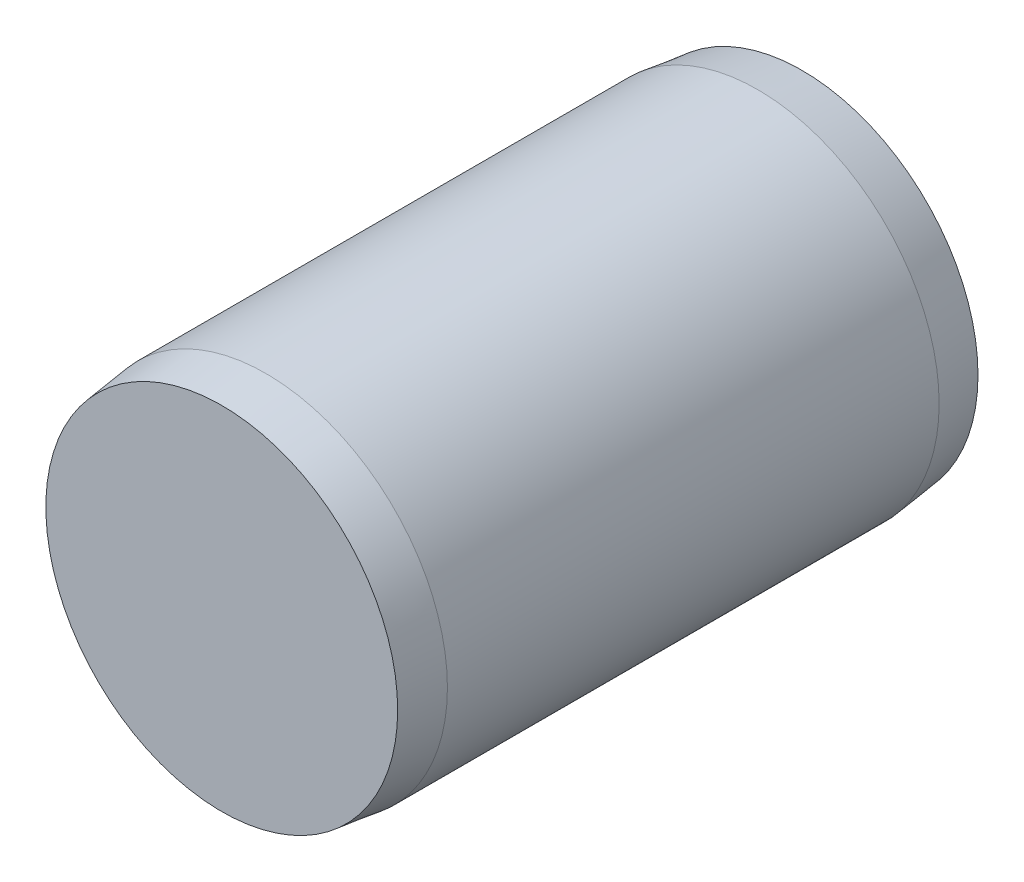
ISO-10303-21;
HEADER;
FILE_DESCRIPTION(('STEP AP214'),'2;1');
FILE_NAME('part.step','',(''),(''),'','','');
FILE_SCHEMA(('AUTOMOTIVE_DESIGN { 1 0 10303 214 1 1 1 1 }'));
ENDSEC;
DATA;
#1=APPLICATION_CONTEXT('core data for automotive mechanical design processes');
#2=APPLICATION_PROTOCOL_DEFINITION('international standard','automotive_design',2000,#1);
#3=PRODUCT_CONTEXT('',#1,'mechanical');
#4=PRODUCT('Part','Part','',(#3));
#5=PRODUCT_RELATED_PRODUCT_CATEGORY('part','',(#4));
#6=PRODUCT_DEFINITION_FORMATION('','',#4);
#7=PRODUCT_DEFINITION_CONTEXT('part definition',#1,'design');
#8=PRODUCT_DEFINITION('design','',#6,#7);
#9=PRODUCT_DEFINITION_SHAPE('','',#8);
#10=(LENGTH_UNIT() NAMED_UNIT(*) SI_UNIT(.MILLI.,.METRE.));
#11=(NAMED_UNIT(*) PLANE_ANGLE_UNIT() SI_UNIT($,.RADIAN.));
#12=(NAMED_UNIT(*) SI_UNIT($,.STERADIAN.) SOLID_ANGLE_UNIT());
#13=UNCERTAINTY_MEASURE_WITH_UNIT(LENGTH_MEASURE(1.E-05),#10,'distance_accuracy_value','');
#14=(GEOMETRIC_REPRESENTATION_CONTEXT(3) GLOBAL_UNCERTAINTY_ASSIGNED_CONTEXT((#13)) GLOBAL_UNIT_ASSIGNED_CONTEXT((#10,
#11,#12)) REPRESENTATION_CONTEXT('',''));
#15=CARTESIAN_POINT('',(0.,0.,0.));
#16=DIRECTION('',(0.,0.,1.));
#17=DIRECTION('',(1.,0.,0.));
#18=AXIS2_PLACEMENT_3D('',#15,#16,#17);
#19=CARTESIAN_POINT('',(0.,0.,-7.3891740179019));
#20=DIRECTION('',(0.,0.,1.));
#21=DIRECTION('',(1.,0.,0.));
#22=AXIS2_PLACEMENT_3D('',#19,#20,#21);
#23=CONICAL_SURFACE('',#22,2.5,0.122173047639603);
#24=CARTESIAN_POINT('',(0.,0.,-8.));
#25=DIRECTION('',(0.,0.,1.));
#26=DIRECTION('',(1.,0.,0.));
#27=AXIS2_PLACEMENT_3D('',#24,#25,#26);
#28=CIRCLE('',#27,2.425);
#29=CARTESIAN_POINT('',(2.425,0.,-8.));
#30=VERTEX_POINT('',#29);
#31=EDGE_CURVE('E10',#30,#30,#28,.T.);
#32=ORIENTED_EDGE('',*,*,#31,.T.);
#33=EDGE_LOOP('',(#32));
#34=FACE_BOUND('',#33,.T.);
#35=CARTESIAN_POINT('',(0.,0.,-7.3891740179019));
#36=DIRECTION('',(0.,0.,1.));
#37=DIRECTION('',(1.,0.,0.));
#38=AXIS2_PLACEMENT_3D('',#35,#36,#37);
#39=CIRCLE('',#38,2.5);
#40=CARTESIAN_POINT('',(2.5,0.,-7.3891740179019));
#41=VERTEX_POINT('',#40);
#42=EDGE_CURVE('E47',#41,#41,#39,.T.);
#43=ORIENTED_EDGE('',*,*,#42,.F.);
#44=EDGE_LOOP('',(#43));
#45=FACE_BOUND('',#44,.T.);
#46=ADVANCED_FACE('F33',(#34,#45),#23,.T.);
#47=CARTESIAN_POINT('',(2.425,0.,-8.));
#48=DIRECTION('',(0.,0.,-1.));
#49=DIRECTION('',(-1.,0.,0.));
#50=AXIS2_PLACEMENT_3D('',#47,#48,#49);
#51=PLANE('',#50);
#52=ORIENTED_EDGE('',*,*,#31,.F.);
#53=EDGE_LOOP('',(#52));
#54=FACE_BOUND('',#53,.T.);
#55=ADVANCED_FACE('F57',(#54),#51,.T.);
#56=CARTESIAN_POINT('',(0.,0.,0.));
#57=DIRECTION('',(0.,0.,1.));
#58=DIRECTION('',(1.,0.,0.));
#59=AXIS2_PLACEMENT_3D('',#56,#57,#58);
#60=PLANE('',#59);
#61=CARTESIAN_POINT('',(0.,0.,0.));
#62=DIRECTION('',(0.,0.,1.));
#63=DIRECTION('',(1.,0.,0.));
#64=AXIS2_PLACEMENT_3D('',#61,#62,#63);
#65=CIRCLE('',#64,2.425);
#66=CARTESIAN_POINT('',(2.425,0.,0.));
#67=VERTEX_POINT('',#66);
#68=EDGE_CURVE('E39',#67,#67,#65,.T.);
#69=ORIENTED_EDGE('',*,*,#68,.T.);
#70=EDGE_LOOP('',(#69));
#71=FACE_BOUND('',#70,.T.);
#72=ADVANCED_FACE('F61',(#71),#60,.T.);
#73=CARTESIAN_POINT('',(0.,0.,0.));
#74=DIRECTION('',(0.,0.,-1.));
#75=DIRECTION('',(-1.,0.,0.));
#76=AXIS2_PLACEMENT_3D('',#73,#74,#75);
#77=CONICAL_SURFACE('',#76,2.425,0.122173047639603);
#78=CARTESIAN_POINT('',(0.,0.,-0.610825982098097));
#79=DIRECTION('',(0.,0.,1.));
#80=DIRECTION('',(1.,0.,0.));
#81=AXIS2_PLACEMENT_3D('',#78,#79,#80);
#82=CIRCLE('',#81,2.5);
#83=CARTESIAN_POINT('',(2.5,0.,-0.610825982098097));
#84=VERTEX_POINT('',#83);
#85=EDGE_CURVE('E43',#84,#84,#82,.T.);
#86=ORIENTED_EDGE('',*,*,#85,.T.);
#87=EDGE_LOOP('',(#86));
#88=FACE_BOUND('',#87,.T.);
#89=ORIENTED_EDGE('',*,*,#68,.F.);
#90=EDGE_LOOP('',(#89));
#91=FACE_BOUND('',#90,.T.);
#92=ADVANCED_FACE('F66',(#88,#91),#77,.T.);
#93=CARTESIAN_POINT('',(0.,0.,-8.));
#94=DIRECTION('',(0.,0.,1.));
#95=DIRECTION('',(1.,0.,0.));
#96=AXIS2_PLACEMENT_3D('',#93,#94,#95);
#97=CYLINDRICAL_SURFACE('',#96,2.5);
#98=ORIENTED_EDGE('',*,*,#42,.T.);
#99=EDGE_LOOP('',(#98));
#100=FACE_BOUND('',#99,.T.);
#101=ORIENTED_EDGE('',*,*,#85,.F.);
#102=EDGE_LOOP('',(#101));
#103=FACE_BOUND('',#102,.T.);
#104=ADVANCED_FACE('F53',(#100,#103),#97,.T.);
#105=CLOSED_SHELL('',(#46,#55,#72,#92,#104));
#106=MANIFOLD_SOLID_BREP('B2',#105);
#107=ADVANCED_BREP_SHAPE_REPRESENTATION('',(#18,#106),#14);
#108=SHAPE_DEFINITION_REPRESENTATION(#9,#107);
ENDSEC;
END-ISO-10303-21;
